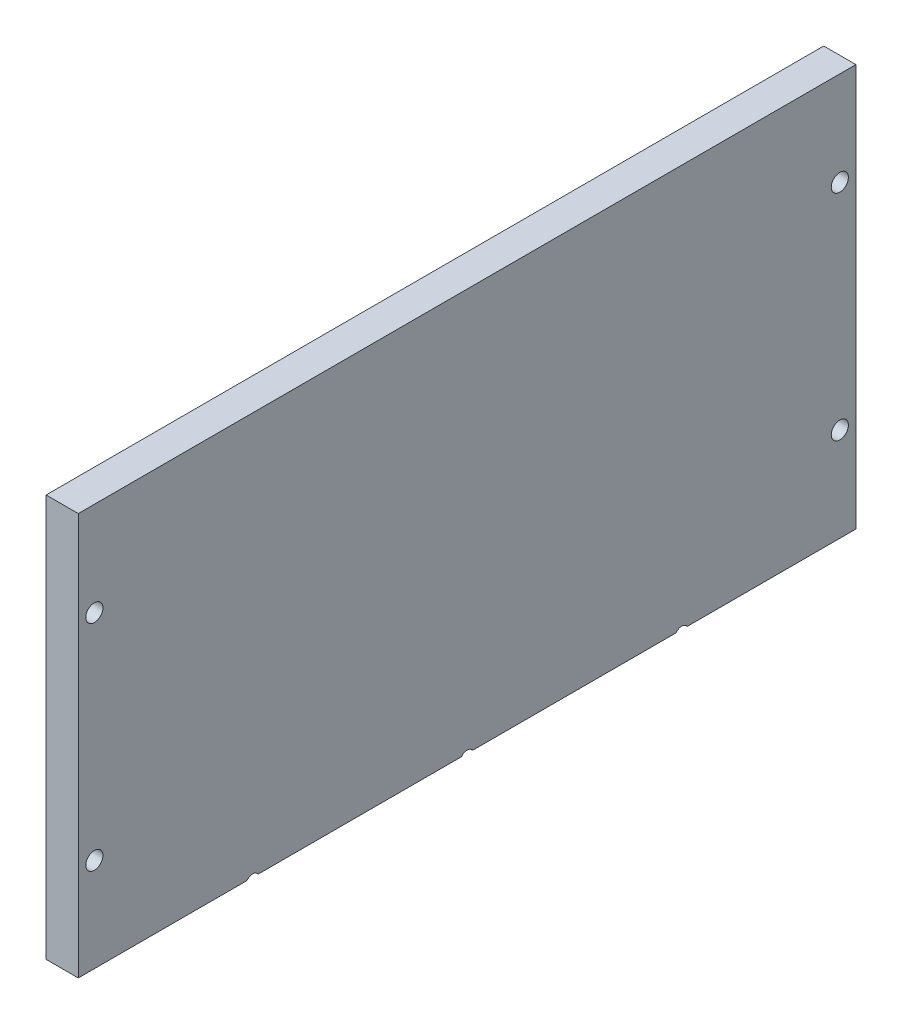
ISO-10303-21;
HEADER;
FILE_DESCRIPTION(('STEP AP214'),'2;1');
FILE_NAME('part.step','',(''),(''),'','','');
FILE_SCHEMA(('AUTOMOTIVE_DESIGN { 1 0 10303 214 1 1 1 1 }'));
ENDSEC;
DATA;
#1=APPLICATION_CONTEXT('core data for automotive mechanical design processes');
#2=APPLICATION_PROTOCOL_DEFINITION('international standard','automotive_design',2000,#1);
#3=PRODUCT_CONTEXT('',#1,'mechanical');
#4=PRODUCT('Part','Part','',(#3));
#5=PRODUCT_RELATED_PRODUCT_CATEGORY('part','',(#4));
#6=PRODUCT_DEFINITION_FORMATION('','',#4);
#7=PRODUCT_DEFINITION_CONTEXT('part definition',#1,'design');
#8=PRODUCT_DEFINITION('design','',#6,#7);
#9=PRODUCT_DEFINITION_SHAPE('','',#8);
#10=(LENGTH_UNIT() NAMED_UNIT(*) SI_UNIT(.MILLI.,.METRE.));
#11=(NAMED_UNIT(*) PLANE_ANGLE_UNIT() SI_UNIT($,.RADIAN.));
#12=(NAMED_UNIT(*) SI_UNIT($,.STERADIAN.) SOLID_ANGLE_UNIT());
#13=UNCERTAINTY_MEASURE_WITH_UNIT(LENGTH_MEASURE(1.E-05),#10,'distance_accuracy_value','');
#14=(GEOMETRIC_REPRESENTATION_CONTEXT(3) GLOBAL_UNCERTAINTY_ASSIGNED_CONTEXT((#13)) GLOBAL_UNIT_ASSIGNED_CONTEXT((#10,
#11,#12)) REPRESENTATION_CONTEXT('',''));
#15=CARTESIAN_POINT('',(0.,0.,0.));
#16=DIRECTION('',(0.,0.,1.));
#17=DIRECTION('',(1.,0.,0.));
#18=AXIS2_PLACEMENT_3D('',#15,#16,#17);
#19=CARTESIAN_POINT('',(150.,5.30000000000001,40.));
#20=DIRECTION('',(-1.,0.,0.));
#21=DIRECTION('',(0.,0.,1.));
#22=AXIS2_PLACEMENT_3D('',#19,#20,#21);
#23=CYLINDRICAL_SURFACE('',#22,1.25);
#24=DIRECTION('',(-1.,0.,0.));
#25=VECTOR('',#24,1.);
#26=CARTESIAN_POINT('',(150.,6.,38.9643842411396));
#27=LINE('',#26,#25);
#28=CARTESIAN_POINT('',(145.914873279289,6.,38.9643842411396));
#29=VERTEX_POINT('',#28);
#30=CARTESIAN_POINT('',(144.,6.,38.9643842411396));
#31=VERTEX_POINT('',#30);
#32=EDGE_CURVE('E331',#29,#31,#27,.T.);
#33=ORIENTED_EDGE('',*,*,#32,.F.);
#34=CARTESIAN_POINT('',(145.914873279289,6.,38.9643842411396));
#35=CARTESIAN_POINT('',(145.895378067969,6.03019536470376,38.9848094297648));
#36=CARTESIAN_POINT('',(145.8757892243,6.05944854114608,39.0064927217974));
#37=CARTESIAN_POINT('',(145.836801784132,6.11606404541694,39.0524353799301));
#38=CARTESIAN_POINT('',(145.817403434823,6.14342413928864,39.0766977066586));
#39=CARTESIAN_POINT('',(145.759864827505,6.22292035150175,39.1537236289597));
#40=CARTESIAN_POINT('',(145.722664062138,6.27205008149254,39.2104426086432));
#41=CARTESIAN_POINT('',(145.661189023043,6.35137851884337,39.3212294163596));
#42=CARTESIAN_POINT('',(145.63583442216,6.38338995846787,39.3734036367012));
#43=CARTESIAN_POINT('',(145.590431903578,6.4400304898611,39.4836171068258));
#44=CARTESIAN_POINT('',(145.570369315415,6.46468001592046,39.5416395129263));
#45=CARTESIAN_POINT('',(145.536929869931,6.50549255454805,39.6631986747258));
#46=CARTESIAN_POINT('',(145.523624331168,6.52156512654416,39.7267862714838));
#47=CARTESIAN_POINT('',(145.505404069747,6.54352558924815,39.8568871937409));
#48=CARTESIAN_POINT('',(145.500483900071,6.54942009152153,39.9233985911498));
#49=CARTESIAN_POINT('',(145.499651978756,6.55041697109249,40.0463697533534));
#50=CARTESIAN_POINT('',(145.502481806553,6.54702693911975,40.1028168646107));
#51=CARTESIAN_POINT('',(145.514302816961,6.53280651950285,40.2140837793545));
#52=CARTESIAN_POINT('',(145.523293087659,6.52197723307181,40.2689038224388));
#53=CARTESIAN_POINT('',(145.546476308376,6.49385625395275,40.3743300414332));
#54=CARTESIAN_POINT('',(145.560551590295,6.47671055991512,40.4250020195228));
#55=CARTESIAN_POINT('',(145.593031003394,6.43674833313038,40.522578033152));
#56=CARTESIAN_POINT('',(145.611438365665,6.41392756689552,40.5694792210386));
#57=CARTESIAN_POINT('',(145.660109278558,6.35275110410988,40.6779080111213));
#58=CARTESIAN_POINT('',(145.692098096733,6.31190366736738,40.7372556956456));
#59=CARTESIAN_POINT('',(145.760206240325,6.22219902131403,40.8468045361186));
#60=CARTESIAN_POINT('',(145.796329542747,6.17333407996286,40.896996762933));
#61=CARTESIAN_POINT('',(145.846687850809,6.1017564901608,40.9593425995155));
#62=CARTESIAN_POINT('',(145.860341129896,6.0820133704883,40.9755029346984));
#63=CARTESIAN_POINT('',(145.887637801025,6.0416660264352,41.0065165190134));
#64=CARTESIAN_POINT('',(145.901281048748,6.02106519141149,41.0213743039443));
#65=CARTESIAN_POINT('',(145.914873279289,6.00000000000001,41.0356157588604));
#66=B_SPLINE_CURVE_WITH_KNOTS('',3,(#34,#35,#36,#37,#38,#39,#40,#41,#42,#43,#44,#45,#46,#47,#48,
#49,#50,#51,#52,#53,#54,#55,#56,#57,#58,#59,#60,#61,#62,#63,#64,#65),.UNSPECIFIED.,.F.,.F.,(4,2,
2,2,2,2,2,2,2,2,2,2,2,2,2,4),(0.,0.123943393598256,0.248030638060021,0.497933208352509,
0.695961675826263,0.893435259828194,1.09295191925463,1.29233892596219,1.46134433598916,
1.63032473398252,1.79562204930606,1.96104304489561,2.19627112642117,2.43172740867712,
2.51850800041088,2.60497328541076),.UNSPECIFIED.);
#67=CARTESIAN_POINT('',(145.914873279289,6.,41.0356157588604));
#68=VERTEX_POINT('',#67);
#69=EDGE_CURVE('E11',#29,#68,#66,.T.);
#70=ORIENTED_EDGE('',*,*,#69,.T.);
#71=DIRECTION('',(-1.,0.,0.));
#72=VECTOR('',#71,1.);
#73=CARTESIAN_POINT('',(150.,6.,41.0356157588604));
#74=LINE('',#73,#72);
#75=CARTESIAN_POINT('',(144.,6.,41.0356157588604));
#76=VERTEX_POINT('',#75);
#77=EDGE_CURVE('E327',#76,#68,#74,.F.);
#78=ORIENTED_EDGE('',*,*,#77,.F.);
#79=CARTESIAN_POINT('',(144.,5.30000000000001,40.));
#80=DIRECTION('',(-1.,0.,0.));
#81=DIRECTION('',(0.,0.,-1.));
#82=AXIS2_PLACEMENT_3D('',#79,#80,#81);
#83=CIRCLE('',#82,1.25);
#84=EDGE_CURVE('E199',#76,#31,#83,.T.);
#85=ORIENTED_EDGE('',*,*,#84,.T.);
#86=EDGE_LOOP('',(#33,#70,#78,#85));
#87=FACE_BOUND('',#86,.T.);
#88=ADVANCED_FACE('F33',(#87),#23,.F.);
#89=CARTESIAN_POINT('',(150.,5.30000000000003,0.));
#90=DIRECTION('',(-1.,0.,0.));
#91=DIRECTION('',(0.,0.,1.));
#92=AXIS2_PLACEMENT_3D('',#89,#90,#91);
#93=CYLINDRICAL_SURFACE('',#92,1.25);
#94=DIRECTION('',(-1.,0.,0.));
#95=VECTOR('',#94,1.);
#96=CARTESIAN_POINT('',(150.,6.,-1.0356157588604));
#97=LINE('',#96,#95);
#98=CARTESIAN_POINT('',(145.891552532619,6.,-1.0356157588604));
#99=VERTEX_POINT('',#98);
#100=CARTESIAN_POINT('',(144.,6.,-1.0356157588604));
#101=VERTEX_POINT('',#100);
#102=EDGE_CURVE('E182',#99,#101,#97,.T.);
#103=ORIENTED_EDGE('',*,*,#102,.F.);
#104=CARTESIAN_POINT('',(145.891552532619,6.,-1.0356157588604));
#105=CARTESIAN_POINT('',(145.87304387942,6.03000904817195,-1.0153174155248));
#106=CARTESIAN_POINT('',(145.854429505135,6.05908322264165,-0.993777961443492));
#107=CARTESIAN_POINT('',(145.8173653144,6.11535151731414,-0.948168297165746));
#108=CARTESIAN_POINT('',(145.798915699704,6.14254355115788,-0.924095350768476));
#109=CARTESIAN_POINT('',(145.744195471656,6.22153988030234,-0.847731388102328));
#110=CARTESIAN_POINT('',(145.708814691779,6.27035706234148,-0.791568975430682));
#111=CARTESIAN_POINT('',(145.650149345889,6.34961903699042,-0.681496536123943));
#112=CARTESIAN_POINT('',(145.62585851846,6.38178684743697,-0.629360048632735));
#113=CARTESIAN_POINT('',(145.582552858259,6.43870903923939,-0.51929050200672));
#114=CARTESIAN_POINT('',(145.563523583011,6.46348372916966,-0.461373916400695));
#115=CARTESIAN_POINT('',(145.532130341812,6.50454808666244,-0.340140664810063));
#116=CARTESIAN_POINT('',(145.51983567403,6.52074948060285,-0.276775343663275));
#117=CARTESIAN_POINT('',(145.50356870977,6.54303239158564,-0.147228080994147));
#118=CARTESIAN_POINT('',(145.499591391412,6.54912001470117,-0.0810478637063257));
#119=CARTESIAN_POINT('',(145.500410654934,6.55058445372357,0.041389496164307));
#120=CARTESIAN_POINT('',(145.503980045475,6.54743161764974,0.0976452638862359));
#121=CARTESIAN_POINT('',(145.517234132449,6.53375335719402,0.208493791423885));
#122=CARTESIAN_POINT('',(145.526918012228,6.52322891734805,0.263086772302014));
#123=CARTESIAN_POINT('',(145.551485707406,6.49573008220917,0.368291174730738));
#124=CARTESIAN_POINT('',(145.566276126633,6.47887108454908,0.418955341353743));
#125=CARTESIAN_POINT('',(145.600194830259,6.43951885488777,0.516495402742283));
#126=CARTESIAN_POINT('',(145.619326260138,6.41702153613782,0.563368516952144));
#127=CARTESIAN_POINT('',(145.66998094465,6.35644255724543,0.672165201315608));
#128=CARTESIAN_POINT('',(145.703287854339,6.31582628363732,0.73184766300849));
#129=CARTESIAN_POINT('',(145.774178536549,6.22661003236268,0.841982440042812));
#130=CARTESIAN_POINT('',(145.811767120037,6.17800104620158,0.89242420309861));
#131=CARTESIAN_POINT('',(145.864891973487,6.10595753790698,0.955846615776711));
#132=CARTESIAN_POINT('',(145.879776376055,6.08542170039115,0.972790464002394));
#133=CARTESIAN_POINT('',(145.909554534328,6.04342156734702,1.00524853668037));
#134=CARTESIAN_POINT('',(145.924448033794,6.0219611473149,1.02076800989712));
#135=CARTESIAN_POINT('',(145.93929541716,5.99999999999999,1.03561575886044));
#136=B_SPLINE_CURVE_WITH_KNOTS('',3,(#104,#105,#106,#107,#108,#109,#110,#111,#112,#113,#114,
#115,#116,#117,#118,#119,#120,#121,#122,#123,#124,#125,#126,#127,#128,#129,#130,#131,#132,#133,
#134,#135),.UNSPECIFIED.,.F.,.F.,(4,2,2,2,2,2,2,2,2,2,2,2,2,2,2,4),(0.,0.121973862371577,
0.244080836723887,0.489945093794552,0.686910796634347,0.883330354665298,1.08173479139558,
1.28001940013506,1.44854572854497,1.61704955322324,1.78262185562488,1.94831451642366,
2.18555551652483,2.42306576451868,2.51453571634267,2.60565380010583),.UNSPECIFIED.);
#137=CARTESIAN_POINT('',(145.93929541716,6.,1.03561575886043));
#138=VERTEX_POINT('',#137);
#139=EDGE_CURVE('E269',#99,#138,#136,.T.);
#140=ORIENTED_EDGE('',*,*,#139,.T.);
#141=DIRECTION('',(-1.,0.,0.));
#142=VECTOR('',#141,1.);
#143=CARTESIAN_POINT('',(150.,6.,1.03561575886043));
#144=LINE('',#143,#142);
#145=CARTESIAN_POINT('',(144.,6.,1.03561575886043));
#146=VERTEX_POINT('',#145);
#147=EDGE_CURVE('E339',#146,#138,#144,.F.);
#148=ORIENTED_EDGE('',*,*,#147,.F.);
#149=CARTESIAN_POINT('',(144.,5.30000000000003,0.));
#150=DIRECTION('',(-1.,0.,0.));
#151=DIRECTION('',(0.,0.,1.));
#152=AXIS2_PLACEMENT_3D('',#149,#150,#151);
#153=CIRCLE('',#152,1.25);
#154=EDGE_CURVE('E354',#146,#101,#153,.T.);
#155=ORIENTED_EDGE('',*,*,#154,.T.);
#156=EDGE_LOOP('',(#103,#140,#148,#155));
#157=FACE_BOUND('',#156,.T.);
#158=ADVANCED_FACE('F260',(#157),#93,.F.);
#159=CARTESIAN_POINT('',(150.,5.30000000000001,-40.));
#160=DIRECTION('',(-1.,0.,0.));
#161=DIRECTION('',(0.,0.,1.));
#162=AXIS2_PLACEMENT_3D('',#159,#160,#161);
#163=CYLINDRICAL_SURFACE('',#162,1.25);
#164=DIRECTION('',(-1.,0.,0.));
#165=VECTOR('',#164,1.);
#166=CARTESIAN_POINT('',(150.,6.,-41.0356157588604));
#167=LINE('',#166,#165);
#168=CARTESIAN_POINT('',(145.914873279289,6.,-41.0356157588604));
#169=VERTEX_POINT('',#168);
#170=CARTESIAN_POINT('',(144.,6.,-41.0356157588604));
#171=VERTEX_POINT('',#170);
#172=EDGE_CURVE('E181',#169,#171,#167,.T.);
#173=ORIENTED_EDGE('',*,*,#172,.F.);
#174=CARTESIAN_POINT('',(145.914873279289,6.,-41.0356157588604));
#175=CARTESIAN_POINT('',(145.895378067969,6.03019536470376,-41.0151905702352));
#176=CARTESIAN_POINT('',(145.8757892243,6.05944854114608,-40.9935072782026));
#177=CARTESIAN_POINT('',(145.836801784132,6.11606404541694,-40.9475646200699));
#178=CARTESIAN_POINT('',(145.817403434823,6.14342413928864,-40.9233022933414));
#179=CARTESIAN_POINT('',(145.759864827505,6.22292035150175,-40.8462763710403));
#180=CARTESIAN_POINT('',(145.722664062138,6.27205008149254,-40.7895573913568));
#181=CARTESIAN_POINT('',(145.661189023043,6.35137851884336,-40.6787705836404));
#182=CARTESIAN_POINT('',(145.63583442216,6.38338995846787,-40.6265963632988));
#183=CARTESIAN_POINT('',(145.590431903578,6.4400304898611,-40.5163828931741));
#184=CARTESIAN_POINT('',(145.570369315415,6.46468001592046,-40.4583604870737));
#185=CARTESIAN_POINT('',(145.536929869931,6.50549255454805,-40.3368013252742));
#186=CARTESIAN_POINT('',(145.523624331168,6.52156512654416,-40.2732137285162));
#187=CARTESIAN_POINT('',(145.505404069747,6.54352558924815,-40.1431128062591));
#188=CARTESIAN_POINT('',(145.500483900071,6.54942009152153,-40.0766014088502));
#189=CARTESIAN_POINT('',(145.499651978756,6.55041697109249,-39.9536302466466));
#190=CARTESIAN_POINT('',(145.502481806553,6.54702693911975,-39.8971831353893));
#191=CARTESIAN_POINT('',(145.514302816961,6.53280651950285,-39.7859162206455));
#192=CARTESIAN_POINT('',(145.523293087659,6.52197723307181,-39.7310961775612));
#193=CARTESIAN_POINT('',(145.546476308376,6.49385625395275,-39.6256699585668));
#194=CARTESIAN_POINT('',(145.560551590295,6.47671055991512,-39.5749979804772));
#195=CARTESIAN_POINT('',(145.593031003394,6.43674833313038,-39.477421966848));
#196=CARTESIAN_POINT('',(145.611438365665,6.41392756689552,-39.4305207789614));
#197=CARTESIAN_POINT('',(145.660109278558,6.35275110410988,-39.3220919888787));
#198=CARTESIAN_POINT('',(145.692098096733,6.31190366736738,-39.2627443043544));
#199=CARTESIAN_POINT('',(145.760206240325,6.22219902131403,-39.1531954638814));
#200=CARTESIAN_POINT('',(145.796329542747,6.17333407996286,-39.103003237067));
#201=CARTESIAN_POINT('',(145.846687850809,6.1017564901608,-39.0406574004845));
#202=CARTESIAN_POINT('',(145.860341129896,6.0820133704883,-39.0244970653016));
#203=CARTESIAN_POINT('',(145.887637801025,6.0416660264352,-38.9934834809866));
#204=CARTESIAN_POINT('',(145.901281048748,6.02106519141149,-38.9786256960557));
#205=CARTESIAN_POINT('',(145.914873279289,6.00000000000001,-38.9643842411396));
#206=B_SPLINE_CURVE_WITH_KNOTS('',3,(#174,#175,#176,#177,#178,#179,#180,#181,#182,#183,#184,
#185,#186,#187,#188,#189,#190,#191,#192,#193,#194,#195,#196,#197,#198,#199,#200,#201,#202,#203,
#204,#205),.UNSPECIFIED.,.F.,.F.,(4,2,2,2,2,2,2,2,2,2,2,2,2,2,2,4),(0.,0.123943393598256,
0.248030638060021,0.497933208352509,0.695961675826255,0.893435259828194,1.09295191925463,
1.29233892596219,1.46134433598916,1.63032473398252,1.79562204930606,1.96104304489561,
2.19627112642117,2.43172740867712,2.51850800041088,2.60497328541076),.UNSPECIFIED.);
#207=CARTESIAN_POINT('',(145.914873279289,6.,-38.9643842411396));
#208=VERTEX_POINT('',#207);
#209=EDGE_CURVE('E161',#169,#208,#206,.T.);
#210=ORIENTED_EDGE('',*,*,#209,.T.);
#211=DIRECTION('',(-1.,0.,0.));
#212=VECTOR('',#211,1.);
#213=CARTESIAN_POINT('',(150.,6.,-38.9643842411396));
#214=LINE('',#213,#212);
#215=CARTESIAN_POINT('',(144.,6.,-38.9643842411396));
#216=VERTEX_POINT('',#215);
#217=EDGE_CURVE('E172',#216,#208,#214,.F.);
#218=ORIENTED_EDGE('',*,*,#217,.F.);
#219=CARTESIAN_POINT('',(144.,5.30000000000001,-40.));
#220=DIRECTION('',(-1.,0.,0.));
#221=DIRECTION('',(0.,0.,1.));
#222=AXIS2_PLACEMENT_3D('',#219,#220,#221);
#223=CIRCLE('',#222,1.25);
#224=EDGE_CURVE('E353',#216,#171,#223,.T.);
#225=ORIENTED_EDGE('',*,*,#224,.T.);
#226=EDGE_LOOP('',(#173,#210,#218,#225));
#227=FACE_BOUND('',#226,.T.);
#228=ADVANCED_FACE('F305',(#227),#163,.F.);
#229=CARTESIAN_POINT('',(150.,63.5,-69.5));
#230=DIRECTION('',(-1.,0.,0.));
#231=DIRECTION('',(0.,0.,1.));
#232=AXIS2_PLACEMENT_3D('',#229,#230,#231);
#233=CYLINDRICAL_SURFACE('',#232,1.60000000000001);
#234=CARTESIAN_POINT('',(150.,63.5,-69.5));
#235=DIRECTION('',(-1.,0.,0.));
#236=DIRECTION('',(0.,0.,1.));
#237=AXIS2_PLACEMENT_3D('',#234,#235,#236);
#238=CIRCLE('',#237,1.60000000000001);
#239=CARTESIAN_POINT('',(150.,63.5,-67.9));
#240=VERTEX_POINT('',#239);
#241=EDGE_CURVE('E363',#240,#240,#238,.T.);
#242=ORIENTED_EDGE('',*,*,#241,.F.);
#243=EDGE_LOOP('',(#242));
#244=FACE_BOUND('',#243,.T.);
#245=CARTESIAN_POINT('',(147.,63.5,-69.5));
#246=DIRECTION('',(-1.,0.,0.));
#247=DIRECTION('',(0.,0.,1.));
#248=AXIS2_PLACEMENT_3D('',#245,#246,#247);
#249=CIRCLE('',#248,1.60000000000001);
#250=CARTESIAN_POINT('',(147.,63.5,-67.9));
#251=VERTEX_POINT('',#250);
#252=EDGE_CURVE('E197',#251,#251,#249,.F.);
#253=ORIENTED_EDGE('',*,*,#252,.F.);
#254=EDGE_LOOP('',(#253));
#255=FACE_BOUND('',#254,.T.);
#256=ADVANCED_FACE('F436',(#244,#255),#233,.F.);
#257=CARTESIAN_POINT('',(150.,23.5,-69.5));
#258=DIRECTION('',(-1.,0.,0.));
#259=DIRECTION('',(0.,0.,1.));
#260=AXIS2_PLACEMENT_3D('',#257,#258,#259);
#261=CYLINDRICAL_SURFACE('',#260,1.6);
#262=CARTESIAN_POINT('',(150.,23.5,-69.5));
#263=DIRECTION('',(-1.,0.,0.));
#264=DIRECTION('',(0.,0.,-1.));
#265=AXIS2_PLACEMENT_3D('',#262,#263,#264);
#266=CIRCLE('',#265,1.6);
#267=CARTESIAN_POINT('',(150.,23.5,-71.1));
#268=VERTEX_POINT('',#267);
#269=EDGE_CURVE('E416',#268,#268,#266,.T.);
#270=ORIENTED_EDGE('',*,*,#269,.F.);
#271=EDGE_LOOP('',(#270));
#272=FACE_BOUND('',#271,.T.);
#273=CARTESIAN_POINT('',(147.,23.5,-69.5));
#274=DIRECTION('',(-1.,0.,0.));
#275=DIRECTION('',(0.,0.,1.));
#276=AXIS2_PLACEMENT_3D('',#273,#274,#275);
#277=CIRCLE('',#276,1.6);
#278=CARTESIAN_POINT('',(147.,23.5,-67.9));
#279=VERTEX_POINT('',#278);
#280=EDGE_CURVE('E194',#279,#279,#277,.F.);
#281=ORIENTED_EDGE('',*,*,#280,.F.);
#282=EDGE_LOOP('',(#281));
#283=FACE_BOUND('',#282,.T.);
#284=ADVANCED_FACE('F427',(#272,#283),#261,.F.);
#285=CARTESIAN_POINT('',(150.,23.5,69.5));
#286=DIRECTION('',(-1.,0.,0.));
#287=DIRECTION('',(0.,0.,1.));
#288=AXIS2_PLACEMENT_3D('',#285,#286,#287);
#289=CYLINDRICAL_SURFACE('',#288,1.6);
#290=CARTESIAN_POINT('',(150.,23.5,69.5));
#291=DIRECTION('',(-1.,0.,0.));
#292=DIRECTION('',(0.,0.,1.));
#293=AXIS2_PLACEMENT_3D('',#290,#291,#292);
#294=CIRCLE('',#293,1.6);
#295=CARTESIAN_POINT('',(150.,23.5,71.1));
#296=VERTEX_POINT('',#295);
#297=EDGE_CURVE('E412',#296,#296,#294,.T.);
#298=ORIENTED_EDGE('',*,*,#297,.F.);
#299=EDGE_LOOP('',(#298));
#300=FACE_BOUND('',#299,.T.);
#301=CARTESIAN_POINT('',(147.,23.5,69.5));
#302=DIRECTION('',(-1.,0.,0.));
#303=DIRECTION('',(0.,0.,1.));
#304=AXIS2_PLACEMENT_3D('',#301,#302,#303);
#305=CIRCLE('',#304,1.6);
#306=CARTESIAN_POINT('',(147.,23.5,71.1));
#307=VERTEX_POINT('',#306);
#308=EDGE_CURVE('E190',#307,#307,#305,.F.);
#309=ORIENTED_EDGE('',*,*,#308,.F.);
#310=EDGE_LOOP('',(#309));
#311=FACE_BOUND('',#310,.T.);
#312=ADVANCED_FACE('F423',(#300,#311),#289,.F.);
#313=CARTESIAN_POINT('',(150.,63.5,69.5));
#314=DIRECTION('',(-1.,0.,0.));
#315=DIRECTION('',(0.,0.,1.));
#316=AXIS2_PLACEMENT_3D('',#313,#314,#315);
#317=CYLINDRICAL_SURFACE('',#316,1.60000000000001);
#318=CARTESIAN_POINT('',(150.,63.5,69.5));
#319=DIRECTION('',(-1.,0.,0.));
#320=DIRECTION('',(0.,0.,-1.));
#321=AXIS2_PLACEMENT_3D('',#318,#319,#320);
#322=CIRCLE('',#321,1.60000000000001);
#323=CARTESIAN_POINT('',(150.,63.5,67.9));
#324=VERTEX_POINT('',#323);
#325=EDGE_CURVE('E409',#324,#324,#322,.T.);
#326=ORIENTED_EDGE('',*,*,#325,.F.);
#327=EDGE_LOOP('',(#326));
#328=FACE_BOUND('',#327,.T.);
#329=CARTESIAN_POINT('',(147.,63.5,69.5));
#330=DIRECTION('',(-1.,0.,0.));
#331=DIRECTION('',(0.,0.,1.));
#332=AXIS2_PLACEMENT_3D('',#329,#330,#331);
#333=CIRCLE('',#332,1.60000000000001);
#334=CARTESIAN_POINT('',(147.,63.5,71.1));
#335=VERTEX_POINT('',#334);
#336=EDGE_CURVE('E187',#335,#335,#333,.F.);
#337=ORIENTED_EDGE('',*,*,#336,.F.);
#338=EDGE_LOOP('',(#337));
#339=FACE_BOUND('',#338,.T.);
#340=ADVANCED_FACE('F426',(#328,#339),#317,.F.);
#341=CARTESIAN_POINT('',(140.,6.,60.));
#342=DIRECTION('',(0.,1.,0.));
#343=DIRECTION('',(0.,0.,1.));
#344=AXIS2_PLACEMENT_3D('',#341,#342,#343);
#345=PLANE('',#344);
#346=CARTESIAN_POINT('',(150.,6.,-41.0356157588604));
#347=VERTEX_POINT('',#346);
#348=CARTESIAN_POINT('',(148.08512672071,6.,-41.0356157588604));
#349=VERTEX_POINT('',#348);
#350=EDGE_CURVE('E162',#347,#349,#167,.T.);
#351=ORIENTED_EDGE('',*,*,#350,.T.);
#352=CARTESIAN_POINT('',(147.,6.,-40.));
#353=DIRECTION('',(0.,-1.,0.));
#354=DIRECTION('',(0.,0.,-1.));
#355=AXIS2_PLACEMENT_3D('',#352,#353,#354);
#356=CIRCLE('',#355,1.5);
#357=EDGE_CURVE('E157',#169,#349,#356,.T.);
#358=ORIENTED_EDGE('',*,*,#357,.F.);
#359=ORIENTED_EDGE('',*,*,#172,.T.);
#360=DIRECTION('',(0.,0.,-1.));
#361=VECTOR('',#360,1.);
#362=CARTESIAN_POINT('',(144.,6.00000000000001,-72.5));
#363=LINE('',#362,#361);
#364=CARTESIAN_POINT('',(144.,6.,-72.5));
#365=VERTEX_POINT('',#364);
#366=EDGE_CURVE('E375',#171,#365,#363,.T.);
#367=ORIENTED_EDGE('',*,*,#366,.T.);
#368=DIRECTION('',(-1.,0.,0.));
#369=VECTOR('',#368,1.);
#370=CARTESIAN_POINT('',(150.,6.,-72.5));
#371=LINE('',#370,#369);
#372=CARTESIAN_POINT('',(150.,6.,-72.5));
#373=VERTEX_POINT('',#372);
#374=EDGE_CURVE('E365',#373,#365,#371,.T.);
#375=ORIENTED_EDGE('',*,*,#374,.F.);
#376=DIRECTION('',(0.,0.,-1.));
#377=VECTOR('',#376,1.);
#378=CARTESIAN_POINT('',(150.,6.,-72.5));
#379=LINE('',#378,#377);
#380=EDGE_CURVE('E360',#347,#373,#379,.T.);
#381=ORIENTED_EDGE('',*,*,#380,.F.);
#382=EDGE_LOOP('',(#351,#358,#359,#367,#375,#381));
#383=FACE_BOUND('',#382,.T.);
#384=ADVANCED_FACE('F317',(#383),#345,.F.);
#385=CARTESIAN_POINT('',(150.,6.,-1.0356157588604));
#386=VERTEX_POINT('',#385);
#387=CARTESIAN_POINT('',(148.108447467381,6.,-1.0356157588604));
#388=VERTEX_POINT('',#387);
#389=EDGE_CURVE('E179',#386,#388,#97,.T.);
#390=ORIENTED_EDGE('',*,*,#389,.T.);
#391=CARTESIAN_POINT('',(147.,6.,-0.0249999999999972));
#392=DIRECTION('',(0.,-1.,0.));
#393=DIRECTION('',(0.,0.,-1.));
#394=AXIS2_PLACEMENT_3D('',#391,#392,#393);
#395=CIRCLE('',#394,1.5);
#396=EDGE_CURVE('E62',#99,#388,#395,.T.);
#397=ORIENTED_EDGE('',*,*,#396,.F.);
#398=ORIENTED_EDGE('',*,*,#102,.T.);
#399=EDGE_CURVE('E462',#101,#216,#363,.T.);
#400=ORIENTED_EDGE('',*,*,#399,.T.);
#401=ORIENTED_EDGE('',*,*,#217,.T.);
#402=CARTESIAN_POINT('',(148.08512672071,6.,-38.9643842411396));
#403=VERTEX_POINT('',#402);
#404=EDGE_CURVE('E154',#403,#208,#356,.T.);
#405=ORIENTED_EDGE('',*,*,#404,.F.);
#406=CARTESIAN_POINT('',(150.,6.,-38.9643842411396));
#407=VERTEX_POINT('',#406);
#408=EDGE_CURVE('E169',#403,#407,#214,.F.);
#409=ORIENTED_EDGE('',*,*,#408,.T.);
#410=EDGE_CURVE('E357',#386,#407,#379,.T.);
#411=ORIENTED_EDGE('',*,*,#410,.F.);
#412=EDGE_LOOP('',(#390,#397,#398,#400,#401,#405,#409,#411));
#413=FACE_BOUND('',#412,.T.);
#414=ADVANCED_FACE('F167',(#413),#345,.F.);
#415=CARTESIAN_POINT('',(150.,6.,38.9643842411396));
#416=VERTEX_POINT('',#415);
#417=CARTESIAN_POINT('',(148.08512672071,6.,38.9643842411396));
#418=VERTEX_POINT('',#417);
#419=EDGE_CURVE('E337',#416,#418,#27,.T.);
#420=ORIENTED_EDGE('',*,*,#419,.T.);
#421=CARTESIAN_POINT('',(147.,6.,40.));
#422=DIRECTION('',(0.,-1.,0.));
#423=DIRECTION('',(0.,0.,-1.));
#424=AXIS2_PLACEMENT_3D('',#421,#422,#423);
#425=CIRCLE('',#424,1.5);
#426=EDGE_CURVE('E54',#29,#418,#425,.T.);
#427=ORIENTED_EDGE('',*,*,#426,.F.);
#428=ORIENTED_EDGE('',*,*,#32,.T.);
#429=EDGE_CURVE('E380',#31,#146,#363,.T.);
#430=ORIENTED_EDGE('',*,*,#429,.T.);
#431=ORIENTED_EDGE('',*,*,#147,.T.);
#432=CARTESIAN_POINT('',(148.06070458284,6.,1.03561575886043));
#433=VERTEX_POINT('',#432);
#434=EDGE_CURVE('E349',#433,#138,#395,.T.);
#435=ORIENTED_EDGE('',*,*,#434,.F.);
#436=CARTESIAN_POINT('',(150.,6.,1.03561575886044));
#437=VERTEX_POINT('',#436);
#438=EDGE_CURVE('E338',#433,#437,#144,.F.);
#439=ORIENTED_EDGE('',*,*,#438,.T.);
#440=EDGE_CURVE('E348',#416,#437,#379,.T.);
#441=ORIENTED_EDGE('',*,*,#440,.F.);
#442=EDGE_LOOP('',(#420,#427,#428,#430,#431,#435,#439,#441));
#443=FACE_BOUND('',#442,.T.);
#444=ADVANCED_FACE('F318',(#443),#345,.F.);
#445=CARTESIAN_POINT('',(-150.,81.,-72.5));
#446=DIRECTION('',(0.,0.,1.));
#447=DIRECTION('',(1.,0.,0.));
#448=AXIS2_PLACEMENT_3D('',#445,#446,#447);
#449=PLANE('',#448);
#450=DIRECTION('',(0.,-1.,0.));
#451=VECTOR('',#450,1.);
#452=CARTESIAN_POINT('',(150.,81.,-72.5));
#453=LINE('',#452,#451);
#454=CARTESIAN_POINT('',(150.,81.,-72.5));
#455=VERTEX_POINT('',#454);
#456=EDGE_CURVE('E328',#455,#373,#453,.T.);
#457=ORIENTED_EDGE('',*,*,#456,.T.);
#458=ORIENTED_EDGE('',*,*,#374,.T.);
#459=DIRECTION('',(0.,-1.,0.));
#460=VECTOR('',#459,1.);
#461=CARTESIAN_POINT('',(144.,81.,-72.5));
#462=LINE('',#461,#460);
#463=CARTESIAN_POINT('',(144.,81.,-72.5));
#464=VERTEX_POINT('',#463);
#465=EDGE_CURVE('E368',#464,#365,#462,.T.);
#466=ORIENTED_EDGE('',*,*,#465,.F.);
#467=DIRECTION('',(-1.,0.,0.));
#468=VECTOR('',#467,1.);
#469=CARTESIAN_POINT('',(-150.,81.,-72.5));
#470=LINE('',#469,#468);
#471=EDGE_CURVE('E385',#455,#464,#470,.T.);
#472=ORIENTED_EDGE('',*,*,#471,.F.);
#473=EDGE_LOOP('',(#457,#458,#466,#472));
#474=FACE_BOUND('',#473,.T.);
#475=ADVANCED_FACE('F450',(#474),#449,.F.);
#476=CARTESIAN_POINT('',(-150.,81.,72.5));
#477=DIRECTION('',(0.,0.,-1.));
#478=DIRECTION('',(-1.,0.,0.));
#479=AXIS2_PLACEMENT_3D('',#476,#477,#478);
#480=PLANE('',#479);
#481=DIRECTION('',(0.,1.,0.));
#482=VECTOR('',#481,1.);
#483=CARTESIAN_POINT('',(144.,0.,72.5));
#484=LINE('',#483,#482);
#485=CARTESIAN_POINT('',(144.,6.,72.5));
#486=VERTEX_POINT('',#485);
#487=CARTESIAN_POINT('',(144.,81.,72.5));
#488=VERTEX_POINT('',#487);
#489=EDGE_CURVE('E373',#486,#488,#484,.T.);
#490=ORIENTED_EDGE('',*,*,#489,.F.);
#491=DIRECTION('',(-1.,0.,0.));
#492=VECTOR('',#491,1.);
#493=CARTESIAN_POINT('',(150.,6.,72.5));
#494=LINE('',#493,#492);
#495=CARTESIAN_POINT('',(150.,6.,72.5));
#496=VERTEX_POINT('',#495);
#497=EDGE_CURVE('E359',#496,#486,#494,.T.);
#498=ORIENTED_EDGE('',*,*,#497,.F.);
#499=DIRECTION('',(0.,-1.,0.));
#500=VECTOR('',#499,1.);
#501=CARTESIAN_POINT('',(150.,81.,72.5));
#502=LINE('',#501,#500);
#503=CARTESIAN_POINT('',(150.,81.,72.5));
#504=VERTEX_POINT('',#503);
#505=EDGE_CURVE('E333',#504,#496,#502,.T.);
#506=ORIENTED_EDGE('',*,*,#505,.F.);
#507=DIRECTION('',(1.,0.,0.));
#508=VECTOR('',#507,1.);
#509=CARTESIAN_POINT('',(-150.,81.,72.5));
#510=LINE('',#509,#508);
#511=EDGE_CURVE('E388',#488,#504,#510,.T.);
#512=ORIENTED_EDGE('',*,*,#511,.F.);
#513=EDGE_LOOP('',(#490,#498,#506,#512));
#514=FACE_BOUND('',#513,.T.);
#515=ADVANCED_FACE('F397',(#514),#480,.F.);
#516=CARTESIAN_POINT('',(0.,81.,0.));
#517=DIRECTION('',(0.,1.,0.));
#518=DIRECTION('',(0.,0.,1.));
#519=AXIS2_PLACEMENT_3D('',#516,#517,#518);
#520=PLANE('',#519);
#521=ORIENTED_EDGE('',*,*,#471,.T.);
#522=DIRECTION('',(0.,0.,-1.));
#523=VECTOR('',#522,1.);
#524=CARTESIAN_POINT('',(144.,81.,-72.5));
#525=LINE('',#524,#523);
#526=EDGE_CURVE('E379',#488,#464,#525,.T.);
#527=ORIENTED_EDGE('',*,*,#526,.F.);
#528=ORIENTED_EDGE('',*,*,#511,.T.);
#529=DIRECTION('',(0.,0.,-1.));
#530=VECTOR('',#529,1.);
#531=CARTESIAN_POINT('',(150.,81.,-72.5));
#532=LINE('',#531,#530);
#533=EDGE_CURVE('E382',#504,#455,#532,.T.);
#534=ORIENTED_EDGE('',*,*,#533,.T.);
#535=EDGE_LOOP('',(#521,#527,#528,#534));
#536=FACE_BOUND('',#535,.T.);
#537=ADVANCED_FACE('F445',(#536),#520,.T.);
#538=CARTESIAN_POINT('',(150.,81.,-72.5));
#539=DIRECTION('',(-1.,0.,0.));
#540=DIRECTION('',(0.,0.,1.));
#541=AXIS2_PLACEMENT_3D('',#538,#539,#540);
#542=PLANE('',#541);
#543=ORIENTED_EDGE('',*,*,#325,.T.);
#544=EDGE_LOOP('',(#543));
#545=FACE_BOUND('',#544,.T.);
#546=ORIENTED_EDGE('',*,*,#297,.T.);
#547=EDGE_LOOP('',(#546));
#548=FACE_BOUND('',#547,.T.);
#549=ORIENTED_EDGE('',*,*,#269,.T.);
#550=EDGE_LOOP('',(#549));
#551=FACE_BOUND('',#550,.T.);
#552=ORIENTED_EDGE('',*,*,#241,.T.);
#553=EDGE_LOOP('',(#552));
#554=FACE_BOUND('',#553,.T.);
#555=ORIENTED_EDGE('',*,*,#410,.T.);
#556=CARTESIAN_POINT('',(150.,5.30000000000001,-40.));
#557=DIRECTION('',(-1.,0.,0.));
#558=DIRECTION('',(0.,0.,1.));
#559=AXIS2_PLACEMENT_3D('',#556,#557,#558);
#560=CIRCLE('',#559,1.25);
#561=EDGE_CURVE('E177',#407,#347,#560,.T.);
#562=ORIENTED_EDGE('',*,*,#561,.T.);
#563=ORIENTED_EDGE('',*,*,#380,.T.);
#564=ORIENTED_EDGE('',*,*,#456,.F.);
#565=ORIENTED_EDGE('',*,*,#533,.F.);
#566=ORIENTED_EDGE('',*,*,#505,.T.);
#567=CARTESIAN_POINT('',(150.,6.,41.0356157588604));
#568=VERTEX_POINT('',#567);
#569=EDGE_CURVE('E356',#496,#568,#379,.T.);
#570=ORIENTED_EDGE('',*,*,#569,.T.);
#571=CARTESIAN_POINT('',(150.,5.30000000000001,40.));
#572=DIRECTION('',(-1.,0.,0.));
#573=DIRECTION('',(0.,0.,-1.));
#574=AXIS2_PLACEMENT_3D('',#571,#572,#573);
#575=CIRCLE('',#574,1.25);
#576=EDGE_CURVE('E324',#568,#416,#575,.T.);
#577=ORIENTED_EDGE('',*,*,#576,.T.);
#578=ORIENTED_EDGE('',*,*,#440,.T.);
#579=CARTESIAN_POINT('',(150.,5.30000000000003,0.));
#580=DIRECTION('',(-1.,0.,0.));
#581=DIRECTION('',(0.,0.,1.));
#582=AXIS2_PLACEMENT_3D('',#579,#580,#581);
#583=CIRCLE('',#582,1.25);
#584=EDGE_CURVE('E351',#437,#386,#583,.T.);
#585=ORIENTED_EDGE('',*,*,#584,.T.);
#586=EDGE_LOOP('',(#555,#562,#563,#564,#565,#566,#570,#577,#578,#585));
#587=FACE_BOUND('',#586,.T.);
#588=ADVANCED_FACE('F35',(#545,#548,#551,#554,#587),#542,.F.);
#589=CARTESIAN_POINT('',(144.,81.,-72.5));
#590=DIRECTION('',(-1.,0.,0.));
#591=DIRECTION('',(0.,0.,1.));
#592=AXIS2_PLACEMENT_3D('',#589,#590,#591);
#593=PLANE('',#592);
#594=CARTESIAN_POINT('',(144.,23.5,-69.5));
#595=DIRECTION('',(-1.,0.,0.));
#596=DIRECTION('',(0.,0.,1.));
#597=AXIS2_PLACEMENT_3D('',#594,#595,#596);
#598=CIRCLE('',#597,2.95);
#599=CARTESIAN_POINT('',(144.,23.5,-66.55));
#600=VERTEX_POINT('',#599);
#601=EDGE_CURVE('E486',#600,#600,#598,.T.);
#602=ORIENTED_EDGE('',*,*,#601,.F.);
#603=EDGE_LOOP('',(#602));
#604=FACE_BOUND('',#603,.T.);
#605=CARTESIAN_POINT('',(144.,63.5,69.5));
#606=DIRECTION('',(-1.,0.,0.));
#607=DIRECTION('',(0.,0.,1.));
#608=AXIS2_PLACEMENT_3D('',#605,#606,#607);
#609=CIRCLE('',#608,2.95);
#610=CARTESIAN_POINT('',(144.,63.5,72.45));
#611=VERTEX_POINT('',#610);
#612=EDGE_CURVE('E479',#611,#611,#609,.T.);
#613=ORIENTED_EDGE('',*,*,#612,.F.);
#614=EDGE_LOOP('',(#613));
#615=FACE_BOUND('',#614,.T.);
#616=CARTESIAN_POINT('',(144.,23.5,69.5));
#617=DIRECTION('',(-1.,0.,0.));
#618=DIRECTION('',(0.,0.,1.));
#619=AXIS2_PLACEMENT_3D('',#616,#617,#618);
#620=CIRCLE('',#619,2.95);
#621=CARTESIAN_POINT('',(144.,23.5,72.45));
#622=VERTEX_POINT('',#621);
#623=EDGE_CURVE('E467',#622,#622,#620,.T.);
#624=ORIENTED_EDGE('',*,*,#623,.F.);
#625=EDGE_LOOP('',(#624));
#626=FACE_BOUND('',#625,.T.);
#627=CARTESIAN_POINT('',(144.,63.5,-69.5));
#628=DIRECTION('',(-1.,0.,0.));
#629=DIRECTION('',(0.,0.,1.));
#630=AXIS2_PLACEMENT_3D('',#627,#628,#629);
#631=CIRCLE('',#630,2.95);
#632=CARTESIAN_POINT('',(144.,63.5,-66.55));
#633=VERTEX_POINT('',#632);
#634=EDGE_CURVE('E485',#633,#633,#631,.T.);
#635=ORIENTED_EDGE('',*,*,#634,.F.);
#636=EDGE_LOOP('',(#635));
#637=FACE_BOUND('',#636,.T.);
#638=ORIENTED_EDGE('',*,*,#224,.F.);
#639=ORIENTED_EDGE('',*,*,#399,.F.);
#640=ORIENTED_EDGE('',*,*,#154,.F.);
#641=ORIENTED_EDGE('',*,*,#429,.F.);
#642=ORIENTED_EDGE('',*,*,#84,.F.);
#643=EDGE_CURVE('E376',#486,#76,#363,.T.);
#644=ORIENTED_EDGE('',*,*,#643,.F.);
#645=ORIENTED_EDGE('',*,*,#489,.T.);
#646=ORIENTED_EDGE('',*,*,#526,.T.);
#647=ORIENTED_EDGE('',*,*,#465,.T.);
#648=ORIENTED_EDGE('',*,*,#366,.F.);
#649=EDGE_LOOP('',(#638,#639,#640,#641,#642,#644,#645,#646,#647,#648));
#650=FACE_BOUND('',#649,.T.);
#651=ADVANCED_FACE('F314',(#604,#615,#626,#637,#650),#593,.T.);
#652=ORIENTED_EDGE('',*,*,#77,.T.);
#653=CARTESIAN_POINT('',(148.08512672071,6.,41.0356157588604));
#654=VERTEX_POINT('',#653);
#655=EDGE_CURVE('E464',#654,#68,#425,.T.);
#656=ORIENTED_EDGE('',*,*,#655,.F.);
#657=EDGE_CURVE('E321',#654,#568,#74,.F.);
#658=ORIENTED_EDGE('',*,*,#657,.T.);
#659=ORIENTED_EDGE('',*,*,#569,.F.);
#660=ORIENTED_EDGE('',*,*,#497,.T.);
#661=ORIENTED_EDGE('',*,*,#643,.T.);
#662=EDGE_LOOP('',(#652,#656,#658,#659,#660,#661));
#663=FACE_BOUND('',#662,.T.);
#664=ADVANCED_FACE('F309',(#663),#345,.F.);
#665=ORIENTED_EDGE('',*,*,#657,.F.);
#666=CARTESIAN_POINT('',(148.08512672071,6.,41.0356157588604));
#667=CARTESIAN_POINT('',(148.104621932031,6.03019536470375,41.0151905702352));
#668=CARTESIAN_POINT('',(148.124210775699,6.05944854114606,40.9935072782026));
#669=CARTESIAN_POINT('',(148.163198215868,6.11606404541693,40.9475646200699));
#670=CARTESIAN_POINT('',(148.182596565177,6.14342413928863,40.9233022933414));
#671=CARTESIAN_POINT('',(148.240135172494,6.22292035150174,40.8462763710403));
#672=CARTESIAN_POINT('',(148.277335937862,6.27205008149253,40.7895573913568));
#673=CARTESIAN_POINT('',(148.338810976957,6.35137851884336,40.6787705836404));
#674=CARTESIAN_POINT('',(148.364165577839,6.38338995846787,40.6265963632988));
#675=CARTESIAN_POINT('',(148.409568096422,6.4400304898611,40.5163828931741));
#676=CARTESIAN_POINT('',(148.429630684585,6.46468001592046,40.4583604870737));
#677=CARTESIAN_POINT('',(148.463070130069,6.50549255454804,40.3368013252742));
#678=CARTESIAN_POINT('',(148.476375668832,6.52156512654416,40.2732137285162));
#679=CARTESIAN_POINT('',(148.494595930253,6.54352558924815,40.1431128062591));
#680=CARTESIAN_POINT('',(148.499516099929,6.54942009152153,40.0766014088502));
#681=CARTESIAN_POINT('',(148.500348021244,6.55041697109249,39.9536302466467));
#682=CARTESIAN_POINT('',(148.497518193447,6.54702693911975,39.8971831353893));
#683=CARTESIAN_POINT('',(148.485697183038,6.53280651950286,39.7859162206455));
#684=CARTESIAN_POINT('',(148.476706912341,6.52197723307182,39.7310961775612));
#685=CARTESIAN_POINT('',(148.453523691624,6.49385625395275,39.6256699585668));
#686=CARTESIAN_POINT('',(148.439448409705,6.47671055991513,39.5749979804772));
#687=CARTESIAN_POINT('',(148.406968996606,6.43674833313039,39.4774219668481));
#688=CARTESIAN_POINT('',(148.388561634335,6.41392756689553,39.4305207789614));
#689=CARTESIAN_POINT('',(148.339890721442,6.35275110410989,39.3220919888787));
#690=CARTESIAN_POINT('',(148.307901903267,6.31190366736739,39.2627443043544));
#691=CARTESIAN_POINT('',(148.239793759675,6.22219902131404,39.1531954638814));
#692=CARTESIAN_POINT('',(148.203670457253,6.17333407996287,39.103003237067));
#693=CARTESIAN_POINT('',(148.153312149191,6.1017564901608,39.0406574004845));
#694=CARTESIAN_POINT('',(148.139658870104,6.08201337048831,39.0244970653016));
#695=CARTESIAN_POINT('',(148.112362198975,6.04166602643521,38.9934834809866));
#696=CARTESIAN_POINT('',(148.098718951252,6.02106519141149,38.9786256960557));
#697=CARTESIAN_POINT('',(148.08512672071,6.00000000000001,38.9643842411396));
#698=B_SPLINE_CURVE_WITH_KNOTS('',3,(#666,#667,#668,#669,#670,#671,#672,#673,#674,#675,#676,
#677,#678,#679,#680,#681,#682,#683,#684,#685,#686,#687,#688,#689,#690,#691,#692,#693,#694,#695,
#696,#697),.UNSPECIFIED.,.F.,.F.,(4,2,2,2,2,2,2,2,2,2,2,2,2,2,2,4),(0.,0.123943393598243,
0.24803063806001,0.497933208352518,0.695961675826272,0.893435259828197,1.09295191925463,
1.29233892596218,1.46134433598916,1.63032473398252,1.79562204930605,1.96104304489561,
2.19627112642116,2.43172740867713,2.51850800041089,2.60497328541078),.UNSPECIFIED.);
#699=EDGE_CURVE('E47',#654,#418,#698,.T.);
#700=ORIENTED_EDGE('',*,*,#699,.T.);
#701=ORIENTED_EDGE('',*,*,#419,.F.);
#702=ORIENTED_EDGE('',*,*,#576,.F.);
#703=EDGE_LOOP('',(#665,#700,#701,#702));
#704=FACE_BOUND('',#703,.T.);
#705=ADVANCED_FACE('F258',(#704),#23,.F.);
#706=ORIENTED_EDGE('',*,*,#438,.F.);
#707=CARTESIAN_POINT('',(148.06070458284,6.,1.03561575886043));
#708=CARTESIAN_POINT('',(148.081244615005,6.03036167510539,1.01508083400638));
#709=CARTESIAN_POINT('',(148.101872296084,6.05979537960176,0.993251697848093));
#710=CARTESIAN_POINT('',(148.142904984282,6.11676639989268,0.946968129698826));
#711=CARTESIAN_POINT('',(148.163309680532,6.1443012970908,0.922510447429156));
#712=CARTESIAN_POINT('',(148.203623854903,6.19759445634175,0.870754520287002));
#713=CARTESIAN_POINT('',(148.223527294671,6.22333468661126,0.843432890661302));
#714=CARTESIAN_POINT('',(148.26223078522,6.27256925622106,0.786152406012389));
#715=CARTESIAN_POINT('',(148.281031430976,6.29606481098191,0.75619499525642));
#716=CARTESIAN_POINT('',(148.327361781825,6.35319927105941,0.67593172858666));
#717=CARTESIAN_POINT('',(148.353817329461,6.38506298098776,0.623696947064007));
#718=CARTESIAN_POINT('',(148.401346786441,6.44139914581271,0.513345932449866));
#719=CARTESIAN_POINT('',(148.422440300212,6.46589858739455,0.45525224175424));
#720=CARTESIAN_POINT('',(148.455134619389,6.50323033862719,0.343069110969231));
#721=CARTESIAN_POINT('',(148.467676842981,6.51725075076948,0.289653585536624));
#722=CARTESIAN_POINT('',(148.486905713814,6.53816410509893,0.180386716883802));
#723=CARTESIAN_POINT('',(148.493592339502,6.54505702105121,0.124535364698586));
#724=CARTESIAN_POINT('',(148.500610556445,6.551218619618,0.0118755544207422));
#725=CARTESIAN_POINT('',(148.500927265636,6.55046945415226,-0.0449348347196539));
#726=CARTESIAN_POINT('',(148.495192569084,6.54131321863681,-0.157596920174592));
#727=CARTESIAN_POINT('',(148.489141074422,6.53290604165974,-0.213448603091809));
#728=CARTESIAN_POINT('',(148.471551553792,6.50938716415551,-0.320599868514467));
#729=CARTESIAN_POINT('',(148.460221577056,6.49453104433535,-0.371991172430819));
#730=CARTESIAN_POINT('',(148.432969687115,6.45891709903927,-0.471384094519499));
#731=CARTESIAN_POINT('',(148.417045377203,6.43815619331772,-0.519383927164644));
#732=CARTESIAN_POINT('',(148.374952820422,6.38288207507174,-0.628375960257661));
#733=CARTESIAN_POINT('',(148.347174175954,6.34612248990964,-0.687606779884988));
#734=CARTESIAN_POINT('',(148.287118367537,6.26471134285444,-0.79783839217785));
#735=CARTESIAN_POINT('',(148.254833328625,6.22004592801349,-0.848824432878275));
#736=CARTESIAN_POINT('',(148.202977688003,6.1453232552618,-0.921585849338481));
#737=CARTESIAN_POINT('',(148.184112649021,6.11756350748393,-0.946293428150988));
#738=CARTESIAN_POINT('',(148.146275962633,6.06018348431718,-0.992962752260848));
#739=CARTESIAN_POINT('',(148.127305330773,6.03057328419275,-1.01493770085459));
#740=CARTESIAN_POINT('',(148.108447467381,6.,-1.0356157588604));
#741=B_SPLINE_CURVE_WITH_KNOTS('',3,(#707,#708,#709,#710,#711,#712,#713,#714,#715,#716,#717,
#718,#719,#720,#721,#722,#723,#724,#725,#726,#727,#728,#729,#730,#731,#732,#733,#734,#735,#736,
#737,#738,#739,#740),.UNSPECIFIED.,.F.,.F.,(4,2,2,2,2,2,2,2,2,2,2,2,2,2,2,2,4),(0.,
0.126027112454321,0.252211894446326,0.379521874403117,0.506762524638863,0.705939255902299,
0.904376938369647,1.07353538321375,1.24269445069391,1.41224867943906,1.58180527567352,
1.74518081502496,1.90864173642102,2.13256418182852,2.35688295014899,2.48179813563749,
2.60608415344952),.UNSPECIFIED.);
#742=EDGE_CURVE('E263',#433,#388,#741,.T.);
#743=ORIENTED_EDGE('',*,*,#742,.T.);
#744=ORIENTED_EDGE('',*,*,#389,.F.);
#745=ORIENTED_EDGE('',*,*,#584,.F.);
#746=EDGE_LOOP('',(#706,#743,#744,#745));
#747=FACE_BOUND('',#746,.T.);
#748=ADVANCED_FACE('F255',(#747),#93,.F.);
#749=ORIENTED_EDGE('',*,*,#408,.F.);
#750=CARTESIAN_POINT('',(148.08512672071,6.,-38.9643842411396));
#751=CARTESIAN_POINT('',(148.104621932031,6.03019536470376,-38.9848094297648));
#752=CARTESIAN_POINT('',(148.124210775699,6.05944854114608,-39.0064927217974));
#753=CARTESIAN_POINT('',(148.163198215868,6.11606404541694,-39.0524353799301));
#754=CARTESIAN_POINT('',(148.182596565177,6.14342413928864,-39.0766977066586));
#755=CARTESIAN_POINT('',(148.240135172494,6.22292035150175,-39.1537236289597));
#756=CARTESIAN_POINT('',(148.277335937862,6.27205008149254,-39.2104426086432));
#757=CARTESIAN_POINT('',(148.338810976957,6.35137851884337,-39.3212294163596));
#758=CARTESIAN_POINT('',(148.364165577839,6.38338995846787,-39.3734036367012));
#759=CARTESIAN_POINT('',(148.409568096422,6.4400304898611,-39.4836171068258));
#760=CARTESIAN_POINT('',(148.429630684585,6.46468001592046,-39.5416395129263));
#761=CARTESIAN_POINT('',(148.463070130069,6.50549255454805,-39.6631986747258));
#762=CARTESIAN_POINT('',(148.476375668832,6.52156512654416,-39.7267862714838));
#763=CARTESIAN_POINT('',(148.494595930253,6.54352558924815,-39.8568871937409));
#764=CARTESIAN_POINT('',(148.499516099929,6.54942009152153,-39.9233985911498));
#765=CARTESIAN_POINT('',(148.500348021244,6.55041697109249,-40.0463697533534));
#766=CARTESIAN_POINT('',(148.497518193447,6.54702693911975,-40.1028168646107));
#767=CARTESIAN_POINT('',(148.485697183038,6.53280651950285,-40.2140837793545));
#768=CARTESIAN_POINT('',(148.476706912341,6.52197723307181,-40.2689038224388));
#769=CARTESIAN_POINT('',(148.453523691624,6.49385625395275,-40.3743300414332));
#770=CARTESIAN_POINT('',(148.439448409705,6.47671055991512,-40.4250020195228));
#771=CARTESIAN_POINT('',(148.406968996606,6.43674833313038,-40.522578033152));
#772=CARTESIAN_POINT('',(148.388561634335,6.41392756689552,-40.5694792210386));
#773=CARTESIAN_POINT('',(148.339890721442,6.35275110410988,-40.6779080111213));
#774=CARTESIAN_POINT('',(148.307901903267,6.31190366736738,-40.7372556956456));
#775=CARTESIAN_POINT('',(148.239793759675,6.22219902131403,-40.8468045361186));
#776=CARTESIAN_POINT('',(148.203670457253,6.17333407996286,-40.896996762933));
#777=CARTESIAN_POINT('',(148.153312149191,6.1017564901608,-40.9593425995155));
#778=CARTESIAN_POINT('',(148.139658870104,6.0820133704883,-40.9755029346984));
#779=CARTESIAN_POINT('',(148.112362198975,6.0416660264352,-41.0065165190134));
#780=CARTESIAN_POINT('',(148.098718951252,6.02106519141149,-41.0213743039443));
#781=CARTESIAN_POINT('',(148.08512672071,6.00000000000001,-41.0356157588604));
#782=B_SPLINE_CURVE_WITH_KNOTS('',3,(#750,#751,#752,#753,#754,#755,#756,#757,#758,#759,#760,
#761,#762,#763,#764,#765,#766,#767,#768,#769,#770,#771,#772,#773,#774,#775,#776,#777,#778,#779,
#780,#781),.UNSPECIFIED.,.F.,.F.,(4,2,2,2,2,2,2,2,2,2,2,2,2,2,2,4),(0.,0.123943393598256,
0.248030638060021,0.497933208352509,0.695961675826263,0.893435259828194,1.09295191925463,
1.29233892596219,1.46134433598916,1.63032473398252,1.79562204930606,1.96104304489561,
2.19627112642117,2.43172740867712,2.51850800041088,2.60497328541076),.UNSPECIFIED.);
#783=EDGE_CURVE('E151',#403,#349,#782,.T.);
#784=ORIENTED_EDGE('',*,*,#783,.T.);
#785=ORIENTED_EDGE('',*,*,#350,.F.);
#786=ORIENTED_EDGE('',*,*,#561,.F.);
#787=EDGE_LOOP('',(#749,#784,#785,#786));
#788=FACE_BOUND('',#787,.T.);
#789=ADVANCED_FACE('F175',(#788),#163,.F.);
#790=CARTESIAN_POINT('',(147.,63.5,69.5));
#791=DIRECTION('',(-1.,0.,0.));
#792=DIRECTION('',(0.,0.,1.));
#793=AXIS2_PLACEMENT_3D('',#790,#791,#792);
#794=PLANE('',#793);
#795=CARTESIAN_POINT('',(147.,63.5,69.5));
#796=DIRECTION('',(-1.,0.,0.));
#797=DIRECTION('',(0.,0.,1.));
#798=AXIS2_PLACEMENT_3D('',#795,#796,#797);
#799=CIRCLE('',#798,2.95);
#800=CARTESIAN_POINT('',(147.,63.5,72.45));
#801=VERTEX_POINT('',#800);
#802=EDGE_CURVE('E489',#801,#801,#799,.T.);
#803=ORIENTED_EDGE('',*,*,#802,.T.);
#804=EDGE_LOOP('',(#803));
#805=FACE_BOUND('',#804,.T.);
#806=ORIENTED_EDGE('',*,*,#336,.T.);
#807=EDGE_LOOP('',(#806));
#808=FACE_BOUND('',#807,.T.);
#809=ADVANCED_FACE('F242',(#805,#808),#794,.T.);
#810=CARTESIAN_POINT('',(147.,63.5,69.5));
#811=DIRECTION('',(-1.,0.,0.));
#812=DIRECTION('',(0.,0.,1.));
#813=AXIS2_PLACEMENT_3D('',#810,#811,#812);
#814=CYLINDRICAL_SURFACE('',#813,2.95);
#815=ORIENTED_EDGE('',*,*,#802,.F.);
#816=EDGE_LOOP('',(#815));
#817=FACE_BOUND('',#816,.T.);
#818=ORIENTED_EDGE('',*,*,#612,.T.);
#819=EDGE_LOOP('',(#818));
#820=FACE_BOUND('',#819,.T.);
#821=ADVANCED_FACE('F228',(#817,#820),#814,.F.);
#822=CARTESIAN_POINT('',(147.,23.5,69.5));
#823=DIRECTION('',(-1.,0.,0.));
#824=DIRECTION('',(0.,0.,1.));
#825=AXIS2_PLACEMENT_3D('',#822,#823,#824);
#826=PLANE('',#825);
#827=CARTESIAN_POINT('',(147.,23.5,69.5));
#828=DIRECTION('',(-1.,0.,0.));
#829=DIRECTION('',(0.,0.,1.));
#830=AXIS2_PLACEMENT_3D('',#827,#828,#829);
#831=CIRCLE('',#830,2.95);
#832=CARTESIAN_POINT('',(147.,23.5,72.45));
#833=VERTEX_POINT('',#832);
#834=EDGE_CURVE('E476',#833,#833,#831,.T.);
#835=ORIENTED_EDGE('',*,*,#834,.T.);
#836=EDGE_LOOP('',(#835));
#837=FACE_BOUND('',#836,.T.);
#838=ORIENTED_EDGE('',*,*,#308,.T.);
#839=EDGE_LOOP('',(#838));
#840=FACE_BOUND('',#839,.T.);
#841=ADVANCED_FACE('F223',(#837,#840),#826,.T.);
#842=CARTESIAN_POINT('',(147.,23.5,69.5));
#843=DIRECTION('',(-1.,0.,0.));
#844=DIRECTION('',(0.,0.,1.));
#845=AXIS2_PLACEMENT_3D('',#842,#843,#844);
#846=CYLINDRICAL_SURFACE('',#845,2.95);
#847=ORIENTED_EDGE('',*,*,#834,.F.);
#848=EDGE_LOOP('',(#847));
#849=FACE_BOUND('',#848,.T.);
#850=ORIENTED_EDGE('',*,*,#623,.T.);
#851=EDGE_LOOP('',(#850));
#852=FACE_BOUND('',#851,.T.);
#853=ADVANCED_FACE('F227',(#849,#852),#846,.F.);
#854=CARTESIAN_POINT('',(147.,23.5,-69.5));
#855=DIRECTION('',(-1.,0.,0.));
#856=DIRECTION('',(0.,0.,1.));
#857=AXIS2_PLACEMENT_3D('',#854,#855,#856);
#858=PLANE('',#857);
#859=CARTESIAN_POINT('',(147.,23.5,-69.5));
#860=DIRECTION('',(-1.,0.,0.));
#861=DIRECTION('',(0.,0.,1.));
#862=AXIS2_PLACEMENT_3D('',#859,#860,#861);
#863=CIRCLE('',#862,2.95);
#864=CARTESIAN_POINT('',(147.,23.5,-66.55));
#865=VERTEX_POINT('',#864);
#866=EDGE_CURVE('E482',#865,#865,#863,.T.);
#867=ORIENTED_EDGE('',*,*,#866,.T.);
#868=EDGE_LOOP('',(#867));
#869=FACE_BOUND('',#868,.T.);
#870=ORIENTED_EDGE('',*,*,#280,.T.);
#871=EDGE_LOOP('',(#870));
#872=FACE_BOUND('',#871,.T.);
#873=ADVANCED_FACE('F232',(#869,#872),#858,.T.);
#874=CARTESIAN_POINT('',(147.,23.5,-69.5));
#875=DIRECTION('',(-1.,0.,0.));
#876=DIRECTION('',(0.,0.,1.));
#877=AXIS2_PLACEMENT_3D('',#874,#875,#876);
#878=CYLINDRICAL_SURFACE('',#877,2.95);
#879=ORIENTED_EDGE('',*,*,#866,.F.);
#880=EDGE_LOOP('',(#879));
#881=FACE_BOUND('',#880,.T.);
#882=ORIENTED_EDGE('',*,*,#601,.T.);
#883=EDGE_LOOP('',(#882));
#884=FACE_BOUND('',#883,.T.);
#885=ADVANCED_FACE('F236',(#881,#884),#878,.F.);
#886=CARTESIAN_POINT('',(147.,63.5,-69.5));
#887=DIRECTION('',(-1.,0.,0.));
#888=DIRECTION('',(0.,0.,1.));
#889=AXIS2_PLACEMENT_3D('',#886,#887,#888);
#890=PLANE('',#889);
#891=CARTESIAN_POINT('',(147.,63.5,-69.5));
#892=DIRECTION('',(-1.,0.,0.));
#893=DIRECTION('',(0.,0.,1.));
#894=AXIS2_PLACEMENT_3D('',#891,#892,#893);
#895=CIRCLE('',#894,2.95);
#896=CARTESIAN_POINT('',(147.,63.5,-66.55));
#897=VERTEX_POINT('',#896);
#898=EDGE_CURVE('E191',#897,#897,#895,.T.);
#899=ORIENTED_EDGE('',*,*,#898,.T.);
#900=EDGE_LOOP('',(#899));
#901=FACE_BOUND('',#900,.T.);
#902=ORIENTED_EDGE('',*,*,#252,.T.);
#903=EDGE_LOOP('',(#902));
#904=FACE_BOUND('',#903,.T.);
#905=ADVANCED_FACE('F240',(#901,#904),#890,.T.);
#906=CARTESIAN_POINT('',(147.,63.5,-69.5));
#907=DIRECTION('',(-1.,0.,0.));
#908=DIRECTION('',(0.,0.,1.));
#909=AXIS2_PLACEMENT_3D('',#906,#907,#908);
#910=CYLINDRICAL_SURFACE('',#909,2.95);
#911=ORIENTED_EDGE('',*,*,#898,.F.);
#912=EDGE_LOOP('',(#911));
#913=FACE_BOUND('',#912,.T.);
#914=ORIENTED_EDGE('',*,*,#634,.T.);
#915=EDGE_LOOP('',(#914));
#916=FACE_BOUND('',#915,.T.);
#917=ADVANCED_FACE('F220',(#913,#916),#910,.F.);
#918=CARTESIAN_POINT('',(147.,16.,-40.));
#919=DIRECTION('',(0.,-1.,0.));
#920=DIRECTION('',(0.,0.,-1.));
#921=AXIS2_PLACEMENT_3D('',#918,#919,#920);
#922=CYLINDRICAL_SURFACE('',#921,1.5);
#923=CARTESIAN_POINT('',(147.,16.,-40.));
#924=DIRECTION('',(0.,-1.,0.));
#925=DIRECTION('',(0.,0.,-1.));
#926=AXIS2_PLACEMENT_3D('',#923,#924,#925);
#927=CIRCLE('',#926,1.5);
#928=CARTESIAN_POINT('',(147.,16.,-41.5));
#929=VERTEX_POINT('',#928);
#930=EDGE_CURVE('E173',#929,#929,#927,.T.);
#931=ORIENTED_EDGE('',*,*,#930,.F.);
#932=EDGE_LOOP('',(#931));
#933=FACE_BOUND('',#932,.T.);
#934=ORIENTED_EDGE('',*,*,#357,.T.);
#935=ORIENTED_EDGE('',*,*,#783,.F.);
#936=ORIENTED_EDGE('',*,*,#404,.T.);
#937=ORIENTED_EDGE('',*,*,#209,.F.);
#938=EDGE_LOOP('',(#934,#935,#936,#937));
#939=FACE_BOUND('',#938,.T.);
#940=ADVANCED_FACE('F153',(#933,#939),#922,.F.);
#941=CARTESIAN_POINT('',(147.,16.,-40.));
#942=DIRECTION('',(0.,-1.,0.));
#943=DIRECTION('',(0.,0.,-1.));
#944=AXIS2_PLACEMENT_3D('',#941,#942,#943);
#945=PLANE('',#944);
#946=ORIENTED_EDGE('',*,*,#930,.T.);
#947=EDGE_LOOP('',(#946));
#948=FACE_BOUND('',#947,.T.);
#949=ADVANCED_FACE('F219',(#948),#945,.T.);
#950=CARTESIAN_POINT('',(147.,16.,-0.0249999999999972));
#951=DIRECTION('',(0.,-1.,0.));
#952=DIRECTION('',(0.,0.,-1.));
#953=AXIS2_PLACEMENT_3D('',#950,#951,#952);
#954=CYLINDRICAL_SURFACE('',#953,1.5);
#955=CARTESIAN_POINT('',(147.,16.,-0.0249999999999972));
#956=DIRECTION('',(0.,-1.,0.));
#957=DIRECTION('',(0.,0.,-1.));
#958=AXIS2_PLACEMENT_3D('',#955,#956,#957);
#959=CIRCLE('',#958,1.5);
#960=CARTESIAN_POINT('',(147.,16.,-1.52499999999999));
#961=VERTEX_POINT('',#960);
#962=EDGE_CURVE('E469',#961,#961,#959,.T.);
#963=ORIENTED_EDGE('',*,*,#962,.F.);
#964=EDGE_LOOP('',(#963));
#965=FACE_BOUND('',#964,.T.);
#966=ORIENTED_EDGE('',*,*,#396,.T.);
#967=ORIENTED_EDGE('',*,*,#742,.F.);
#968=ORIENTED_EDGE('',*,*,#434,.T.);
#969=ORIENTED_EDGE('',*,*,#139,.F.);
#970=EDGE_LOOP('',(#966,#967,#968,#969));
#971=FACE_BOUND('',#970,.T.);
#972=ADVANCED_FACE('F279',(#965,#971),#954,.F.);
#973=CARTESIAN_POINT('',(147.,16.,-0.0249999999999972));
#974=DIRECTION('',(0.,-1.,0.));
#975=DIRECTION('',(0.,0.,-1.));
#976=AXIS2_PLACEMENT_3D('',#973,#974,#975);
#977=PLANE('',#976);
#978=ORIENTED_EDGE('',*,*,#962,.T.);
#979=EDGE_LOOP('',(#978));
#980=FACE_BOUND('',#979,.T.);
#981=ADVANCED_FACE('F283',(#980),#977,.T.);
#982=CARTESIAN_POINT('',(147.,16.,40.));
#983=DIRECTION('',(0.,-1.,0.));
#984=DIRECTION('',(0.,0.,-1.));
#985=AXIS2_PLACEMENT_3D('',#982,#983,#984);
#986=CYLINDRICAL_SURFACE('',#985,1.5);
#987=CARTESIAN_POINT('',(147.,16.,40.));
#988=DIRECTION('',(0.,-1.,0.));
#989=DIRECTION('',(0.,0.,-1.));
#990=AXIS2_PLACEMENT_3D('',#987,#988,#989);
#991=CIRCLE('',#990,1.5);
#992=CARTESIAN_POINT('',(147.,16.,38.5));
#993=VERTEX_POINT('',#992);
#994=EDGE_CURVE('E465',#993,#993,#991,.T.);
#995=ORIENTED_EDGE('',*,*,#994,.F.);
#996=EDGE_LOOP('',(#995));
#997=FACE_BOUND('',#996,.T.);
#998=ORIENTED_EDGE('',*,*,#426,.T.);
#999=ORIENTED_EDGE('',*,*,#699,.F.);
#1000=ORIENTED_EDGE('',*,*,#655,.T.);
#1001=ORIENTED_EDGE('',*,*,#69,.F.);
#1002=EDGE_LOOP('',(#998,#999,#1000,#1001));
#1003=FACE_BOUND('',#1002,.T.);
#1004=ADVANCED_FACE('F287',(#997,#1003),#986,.F.);
#1005=CARTESIAN_POINT('',(147.,16.,40.));
#1006=DIRECTION('',(0.,-1.,0.));
#1007=DIRECTION('',(0.,0.,-1.));
#1008=AXIS2_PLACEMENT_3D('',#1005,#1006,#1007);
#1009=PLANE('',#1008);
#1010=ORIENTED_EDGE('',*,*,#994,.T.);
#1011=EDGE_LOOP('',(#1010));
#1012=FACE_BOUND('',#1011,.T.);
#1013=ADVANCED_FACE('F292',(#1012),#1009,.T.);
#1014=CLOSED_SHELL('',(#88,#158,#228,#256,#284,#312,#340,#384,#414,#444,#475,#515,#537,#588,
#651,#664,#705,#748,#789,#809,#821,#841,#853,#873,#885,#905,#917,#940,#949,#972,#981,#1004,#1013));
#1015=MANIFOLD_SOLID_BREP('B2',#1014);
#1016=ADVANCED_BREP_SHAPE_REPRESENTATION('',(#18,#1015),#14);
#1017=SHAPE_DEFINITION_REPRESENTATION(#9,#1016);
ENDSEC;
END-ISO-10303-21;
